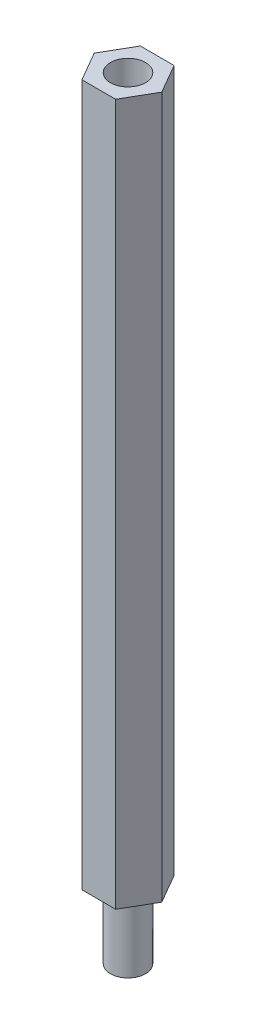
ISO-10303-21;
HEADER;
FILE_DESCRIPTION(('STEP AP214'),'2;1');
FILE_NAME('part.step','',(''),(''),'','','');
FILE_SCHEMA(('AUTOMOTIVE_DESIGN { 1 0 10303 214 1 1 1 1 }'));
ENDSEC;
DATA;
#1=APPLICATION_CONTEXT('core data for automotive mechanical design processes');
#2=APPLICATION_PROTOCOL_DEFINITION('international standard','automotive_design',2000,#1);
#3=PRODUCT_CONTEXT('',#1,'mechanical');
#4=PRODUCT('Part','Part','',(#3));
#5=PRODUCT_RELATED_PRODUCT_CATEGORY('part','',(#4));
#6=PRODUCT_DEFINITION_FORMATION('','',#4);
#7=PRODUCT_DEFINITION_CONTEXT('part definition',#1,'design');
#8=PRODUCT_DEFINITION('design','',#6,#7);
#9=PRODUCT_DEFINITION_SHAPE('','',#8);
#10=(LENGTH_UNIT() NAMED_UNIT(*) SI_UNIT(.MILLI.,.METRE.));
#11=(NAMED_UNIT(*) PLANE_ANGLE_UNIT() SI_UNIT($,.RADIAN.));
#12=(NAMED_UNIT(*) SI_UNIT($,.STERADIAN.) SOLID_ANGLE_UNIT());
#13=UNCERTAINTY_MEASURE_WITH_UNIT(LENGTH_MEASURE(1.E-05),#10,'distance_accuracy_value','');
#14=(GEOMETRIC_REPRESENTATION_CONTEXT(3) GLOBAL_UNCERTAINTY_ASSIGNED_CONTEXT((#13)) GLOBAL_UNIT_ASSIGNED_CONTEXT((#10,
#11,#12)) REPRESENTATION_CONTEXT('',''));
#15=CARTESIAN_POINT('',(0.,0.,0.));
#16=DIRECTION('',(0.,0.,1.));
#17=DIRECTION('',(1.,0.,0.));
#18=AXIS2_PLACEMENT_3D('',#15,#16,#17);
#19=CARTESIAN_POINT('',(0.,-6.,0.));
#20=DIRECTION('',(0.,1.,0.));
#21=DIRECTION('',(0.,0.,1.));
#22=AXIS2_PLACEMENT_3D('',#19,#20,#21);
#23=CYLINDRICAL_SURFACE('',#22,1.5);
#24=CARTESIAN_POINT('',(0.,-6.,0.));
#25=DIRECTION('',(0.,-1.,0.));
#26=DIRECTION('',(0.,0.,-1.));
#27=AXIS2_PLACEMENT_3D('',#24,#25,#26);
#28=CIRCLE('',#27,1.5);
#29=CARTESIAN_POINT('',(0.,-6.,-1.5));
#30=VERTEX_POINT('',#29);
#31=EDGE_CURVE('E11',#30,#30,#28,.T.);
#32=ORIENTED_EDGE('',*,*,#31,.F.);
#33=EDGE_LOOP('',(#32));
#34=FACE_BOUND('',#33,.T.);
#35=CARTESIAN_POINT('',(0.,0.,0.));
#36=DIRECTION('',(0.,-1.,0.));
#37=DIRECTION('',(0.,0.,-1.));
#38=AXIS2_PLACEMENT_3D('',#35,#36,#37);
#39=CIRCLE('',#38,1.5);
#40=CARTESIAN_POINT('',(0.,0.,-1.5));
#41=VERTEX_POINT('',#40);
#42=EDGE_CURVE('E44',#41,#41,#39,.T.);
#43=ORIENTED_EDGE('',*,*,#42,.T.);
#44=EDGE_LOOP('',(#43));
#45=FACE_BOUND('',#44,.T.);
#46=ADVANCED_FACE('F41',(#34,#45),#23,.T.);
#47=CARTESIAN_POINT('',(0.,-6.,0.));
#48=DIRECTION('',(0.,-1.,0.));
#49=DIRECTION('',(0.,0.,-1.));
#50=AXIS2_PLACEMENT_3D('',#47,#48,#49);
#51=PLANE('',#50);
#52=ORIENTED_EDGE('',*,*,#31,.T.);
#53=EDGE_LOOP('',(#52));
#54=FACE_BOUND('',#53,.T.);
#55=ADVANCED_FACE('F56',(#54),#51,.T.);
#56=CARTESIAN_POINT('',(0.,0.,0.));
#57=DIRECTION('',(0.,-1.,0.));
#58=DIRECTION('',(0.,0.,-1.));
#59=AXIS2_PLACEMENT_3D('',#56,#57,#58);
#60=PLANE('',#59);
#61=ORIENTED_EDGE('',*,*,#42,.F.);
#62=EDGE_LOOP('',(#61));
#63=FACE_BOUND('',#62,.T.);
#64=ADVANCED_FACE('F54',(#63),#60,.F.);
#65=CLOSED_SHELL('',(#46,#55,#64));
#66=MANIFOLD_SOLID_BREP('B2',#65);
#67=CARTESIAN_POINT('',(0.,60.,0.));
#68=DIRECTION('',(0.,1.,0.));
#69=DIRECTION('',(0.,0.,1.));
#70=AXIS2_PLACEMENT_3D('',#67,#68,#69);
#71=PLANE('',#70);
#72=DIRECTION('',(1.,0.,0.));
#73=VECTOR('',#72,1.);
#74=CARTESIAN_POINT('',(-1.44337567297405,60.,2.5));
#75=LINE('',#74,#73);
#76=CARTESIAN_POINT('',(-1.44337567297405,60.,2.5));
#77=VERTEX_POINT('',#76);
#78=CARTESIAN_POINT('',(1.44337567297408,60.,2.5));
#79=VERTEX_POINT('',#78);
#80=EDGE_CURVE('E178',#77,#79,#75,.T.);
#81=ORIENTED_EDGE('',*,*,#80,.T.);
#82=DIRECTION('',(0.500000000000001,0.,-0.866025403784438));
#83=VECTOR('',#82,1.);
#84=CARTESIAN_POINT('',(1.44337567297408,60.,2.5));
#85=LINE('',#84,#83);
#86=CARTESIAN_POINT('',(2.88675134594815,60.,0.));
#87=VERTEX_POINT('',#86);
#88=EDGE_CURVE('E136',#79,#87,#85,.T.);
#89=ORIENTED_EDGE('',*,*,#88,.T.);
#90=DIRECTION('',(-0.500000000000001,0.,-0.866025403784438));
#91=VECTOR('',#90,1.);
#92=CARTESIAN_POINT('',(2.88675134594815,60.,0.));
#93=LINE('',#92,#91);
#94=CARTESIAN_POINT('',(1.44337567297408,60.,-2.50000000000001));
#95=VERTEX_POINT('',#94);
#96=EDGE_CURVE('E149',#87,#95,#93,.T.);
#97=ORIENTED_EDGE('',*,*,#96,.T.);
#98=DIRECTION('',(-1.,0.,0.));
#99=VECTOR('',#98,1.);
#100=CARTESIAN_POINT('',(1.44337567297408,60.,-2.50000000000001));
#101=LINE('',#100,#99);
#102=CARTESIAN_POINT('',(-1.44337567297405,60.,-2.50000000000001));
#103=VERTEX_POINT('',#102);
#104=EDGE_CURVE('E143',#95,#103,#101,.T.);
#105=ORIENTED_EDGE('',*,*,#104,.T.);
#106=DIRECTION('',(-0.5,0.,0.866025403784438));
#107=VECTOR('',#106,1.);
#108=CARTESIAN_POINT('',(-1.44337567297405,60.,-2.50000000000001));
#109=LINE('',#108,#107);
#110=CARTESIAN_POINT('',(-2.88675134594812,60.,0.));
#111=VERTEX_POINT('',#110);
#112=EDGE_CURVE('E147',#103,#111,#109,.T.);
#113=ORIENTED_EDGE('',*,*,#112,.T.);
#114=DIRECTION('',(0.5,0.,0.866025403784438));
#115=VECTOR('',#114,1.);
#116=CARTESIAN_POINT('',(-2.88675134594812,60.,0.));
#117=LINE('',#116,#115);
#118=EDGE_CURVE('E99',#111,#77,#117,.T.);
#119=ORIENTED_EDGE('',*,*,#118,.T.);
#120=EDGE_LOOP('',(#81,#89,#97,#105,#113,#119));
#121=FACE_BOUND('',#120,.T.);
#122=CARTESIAN_POINT('',(0.,60.,0.));
#123=DIRECTION('',(0.,1.,0.));
#124=DIRECTION('',(0.,0.,1.));
#125=AXIS2_PLACEMENT_3D('',#122,#123,#124);
#126=CIRCLE('',#125,1.5);
#127=CARTESIAN_POINT('',(0.,60.,1.5));
#128=VERTEX_POINT('',#127);
#129=EDGE_CURVE('E171',#128,#128,#126,.T.);
#130=ORIENTED_EDGE('',*,*,#129,.F.);
#131=EDGE_LOOP('',(#130));
#132=FACE_BOUND('',#131,.T.);
#133=ADVANCED_FACE('F82',(#121,#132),#71,.T.);
#134=CARTESIAN_POINT('',(0.,0.,0.));
#135=DIRECTION('',(0.,1.,0.));
#136=DIRECTION('',(0.,0.,1.));
#137=AXIS2_PLACEMENT_3D('',#134,#135,#136);
#138=PLANE('',#137);
#139=DIRECTION('',(1.,0.,0.));
#140=VECTOR('',#139,1.);
#141=CARTESIAN_POINT('',(-1.44337567297405,0.,2.5));
#142=LINE('',#141,#140);
#143=CARTESIAN_POINT('',(-1.44337567297405,0.,2.5));
#144=VERTEX_POINT('',#143);
#145=CARTESIAN_POINT('',(1.44337567297408,0.,2.5));
#146=VERTEX_POINT('',#145);
#147=EDGE_CURVE('E167',#144,#146,#142,.T.);
#148=ORIENTED_EDGE('',*,*,#147,.F.);
#149=DIRECTION('',(0.5,0.,0.866025403784438));
#150=VECTOR('',#149,1.);
#151=CARTESIAN_POINT('',(-2.88675134594812,0.,0.));
#152=LINE('',#151,#150);
#153=CARTESIAN_POINT('',(-2.88675134594812,0.,0.));
#154=VERTEX_POINT('',#153);
#155=EDGE_CURVE('E128',#154,#144,#152,.T.);
#156=ORIENTED_EDGE('',*,*,#155,.F.);
#157=DIRECTION('',(-0.5,0.,0.866025403784438));
#158=VECTOR('',#157,1.);
#159=CARTESIAN_POINT('',(-1.44337567297405,0.,-2.50000000000001));
#160=LINE('',#159,#158);
#161=CARTESIAN_POINT('',(-1.44337567297405,0.,-2.50000000000001));
#162=VERTEX_POINT('',#161);
#163=EDGE_CURVE('E122',#162,#154,#160,.T.);
#164=ORIENTED_EDGE('',*,*,#163,.F.);
#165=DIRECTION('',(-1.,0.,0.));
#166=VECTOR('',#165,1.);
#167=CARTESIAN_POINT('',(1.44337567297408,0.,-2.50000000000001));
#168=LINE('',#167,#166);
#169=CARTESIAN_POINT('',(1.44337567297408,0.,-2.50000000000001));
#170=VERTEX_POINT('',#169);
#171=EDGE_CURVE('E157',#170,#162,#168,.T.);
#172=ORIENTED_EDGE('',*,*,#171,.F.);
#173=DIRECTION('',(-0.500000000000001,0.,-0.866025403784438));
#174=VECTOR('',#173,1.);
#175=CARTESIAN_POINT('',(2.88675134594815,0.,0.));
#176=LINE('',#175,#174);
#177=CARTESIAN_POINT('',(2.88675134594815,0.,0.));
#178=VERTEX_POINT('',#177);
#179=EDGE_CURVE('E173',#178,#170,#176,.T.);
#180=ORIENTED_EDGE('',*,*,#179,.F.);
#181=DIRECTION('',(0.500000000000001,0.,-0.866025403784438));
#182=VECTOR('',#181,1.);
#183=CARTESIAN_POINT('',(1.44337567297408,0.,2.5));
#184=LINE('',#183,#182);
#185=EDGE_CURVE('E170',#146,#178,#184,.T.);
#186=ORIENTED_EDGE('',*,*,#185,.F.);
#187=EDGE_LOOP('',(#148,#156,#164,#172,#180,#186));
#188=FACE_BOUND('',#187,.T.);
#189=CARTESIAN_POINT('',(0.,0.,0.));
#190=DIRECTION('',(0.,1.,0.));
#191=DIRECTION('',(0.,0.,1.));
#192=AXIS2_PLACEMENT_3D('',#189,#190,#191);
#193=CIRCLE('',#192,1.5);
#194=CARTESIAN_POINT('',(0.,0.,1.5));
#195=VERTEX_POINT('',#194);
#196=EDGE_CURVE('E271',#195,#195,#193,.T.);
#197=ORIENTED_EDGE('',*,*,#196,.T.);
#198=EDGE_LOOP('',(#197));
#199=FACE_BOUND('',#198,.T.);
#200=ADVANCED_FACE('F187',(#188,#199),#138,.F.);
#201=CARTESIAN_POINT('',(-1.44337567297405,60.,2.5));
#202=DIRECTION('',(0.,0.,-1.));
#203=DIRECTION('',(-1.,0.,0.));
#204=AXIS2_PLACEMENT_3D('',#201,#202,#203);
#205=PLANE('',#204);
#206=ORIENTED_EDGE('',*,*,#147,.T.);
#207=DIRECTION('',(0.,-1.,0.));
#208=VECTOR('',#207,1.);
#209=CARTESIAN_POINT('',(1.44337567297408,60.,2.5));
#210=LINE('',#209,#208);
#211=EDGE_CURVE('E39',#79,#146,#210,.T.);
#212=ORIENTED_EDGE('',*,*,#211,.F.);
#213=ORIENTED_EDGE('',*,*,#80,.F.);
#214=DIRECTION('',(0.,-1.,0.));
#215=VECTOR('',#214,1.);
#216=CARTESIAN_POINT('',(-1.44337567297405,60.,2.5));
#217=LINE('',#216,#215);
#218=EDGE_CURVE('E163',#77,#144,#217,.T.);
#219=ORIENTED_EDGE('',*,*,#218,.T.);
#220=EDGE_LOOP('',(#206,#212,#213,#219));
#221=FACE_BOUND('',#220,.T.);
#222=ADVANCED_FACE('F84',(#221),#205,.F.);
#223=CARTESIAN_POINT('',(1.44337567297408,60.,2.5));
#224=DIRECTION('',(-0.866025403784438,0.,-0.500000000000001));
#225=DIRECTION('',(-0.500000000000001,0.,0.866025403784438));
#226=AXIS2_PLACEMENT_3D('',#223,#224,#225);
#227=PLANE('',#226);
#228=ORIENTED_EDGE('',*,*,#185,.T.);
#229=DIRECTION('',(0.,-1.,0.));
#230=VECTOR('',#229,1.);
#231=CARTESIAN_POINT('',(2.88675134594815,60.,0.));
#232=LINE('',#231,#230);
#233=EDGE_CURVE('E91',#87,#178,#232,.T.);
#234=ORIENTED_EDGE('',*,*,#233,.F.);
#235=ORIENTED_EDGE('',*,*,#88,.F.);
#236=ORIENTED_EDGE('',*,*,#211,.T.);
#237=EDGE_LOOP('',(#228,#234,#235,#236));
#238=FACE_BOUND('',#237,.T.);
#239=ADVANCED_FACE('F212',(#238),#227,.F.);
#240=CARTESIAN_POINT('',(2.88675134594815,60.,0.));
#241=DIRECTION('',(-0.866025403784438,0.,0.500000000000001));
#242=DIRECTION('',(0.500000000000001,0.,0.866025403784438));
#243=AXIS2_PLACEMENT_3D('',#240,#241,#242);
#244=PLANE('',#243);
#245=ORIENTED_EDGE('',*,*,#179,.T.);
#246=DIRECTION('',(0.,-1.,0.));
#247=VECTOR('',#246,1.);
#248=CARTESIAN_POINT('',(1.44337567297408,60.,-2.50000000000001));
#249=LINE('',#248,#247);
#250=EDGE_CURVE('E158',#95,#170,#249,.T.);
#251=ORIENTED_EDGE('',*,*,#250,.F.);
#252=ORIENTED_EDGE('',*,*,#96,.F.);
#253=ORIENTED_EDGE('',*,*,#233,.T.);
#254=EDGE_LOOP('',(#245,#251,#252,#253));
#255=FACE_BOUND('',#254,.T.);
#256=ADVANCED_FACE('F184',(#255),#244,.F.);
#257=CARTESIAN_POINT('',(1.44337567297408,60.,-2.50000000000001));
#258=DIRECTION('',(0.,0.,1.));
#259=DIRECTION('',(1.,0.,0.));
#260=AXIS2_PLACEMENT_3D('',#257,#258,#259);
#261=PLANE('',#260);
#262=ORIENTED_EDGE('',*,*,#171,.T.);
#263=DIRECTION('',(0.,-1.,0.));
#264=VECTOR('',#263,1.);
#265=CARTESIAN_POINT('',(-1.44337567297405,60.,-2.50000000000001));
#266=LINE('',#265,#264);
#267=EDGE_CURVE('E154',#103,#162,#266,.T.);
#268=ORIENTED_EDGE('',*,*,#267,.F.);
#269=ORIENTED_EDGE('',*,*,#104,.F.);
#270=ORIENTED_EDGE('',*,*,#250,.T.);
#271=EDGE_LOOP('',(#262,#268,#269,#270));
#272=FACE_BOUND('',#271,.T.);
#273=ADVANCED_FACE('F155',(#272),#261,.F.);
#274=CARTESIAN_POINT('',(-1.44337567297405,60.,-2.50000000000001));
#275=DIRECTION('',(0.866025403784439,0.,0.5));
#276=DIRECTION('',(0.5,0.,-0.866025403784439));
#277=AXIS2_PLACEMENT_3D('',#274,#275,#276);
#278=PLANE('',#277);
#279=ORIENTED_EDGE('',*,*,#163,.T.);
#280=DIRECTION('',(0.,-1.,0.));
#281=VECTOR('',#280,1.);
#282=CARTESIAN_POINT('',(-2.88675134594812,60.,0.));
#283=LINE('',#282,#281);
#284=EDGE_CURVE('E159',#111,#154,#283,.T.);
#285=ORIENTED_EDGE('',*,*,#284,.F.);
#286=ORIENTED_EDGE('',*,*,#112,.F.);
#287=ORIENTED_EDGE('',*,*,#267,.T.);
#288=EDGE_LOOP('',(#279,#285,#286,#287));
#289=FACE_BOUND('',#288,.T.);
#290=ADVANCED_FACE('F161',(#289),#278,.F.);
#291=CARTESIAN_POINT('',(-2.88675134594812,60.,0.));
#292=DIRECTION('',(0.866025403784438,0.,-0.5));
#293=DIRECTION('',(-0.5,0.,-0.866025403784438));
#294=AXIS2_PLACEMENT_3D('',#291,#292,#293);
#295=PLANE('',#294);
#296=ORIENTED_EDGE('',*,*,#155,.T.);
#297=ORIENTED_EDGE('',*,*,#218,.F.);
#298=ORIENTED_EDGE('',*,*,#118,.F.);
#299=ORIENTED_EDGE('',*,*,#284,.T.);
#300=EDGE_LOOP('',(#296,#297,#298,#299));
#301=FACE_BOUND('',#300,.T.);
#302=ADVANCED_FACE('F192',(#301),#295,.F.);
#303=CARTESIAN_POINT('',(0.,60.,0.));
#304=DIRECTION('',(0.,-1.,0.));
#305=DIRECTION('',(0.,0.,-1.));
#306=AXIS2_PLACEMENT_3D('',#303,#304,#305);
#307=CYLINDRICAL_SURFACE('',#306,1.5);
#308=ORIENTED_EDGE('',*,*,#129,.T.);
#309=EDGE_LOOP('',(#308));
#310=FACE_BOUND('',#309,.T.);
#311=ORIENTED_EDGE('',*,*,#196,.F.);
#312=EDGE_LOOP('',(#311));
#313=FACE_BOUND('',#312,.T.);
#314=ADVANCED_FACE('F194',(#310,#313),#307,.F.);
#315=CLOSED_SHELL('',(#133,#200,#222,#239,#256,#273,#290,#302,#314));
#316=MANIFOLD_SOLID_BREP('B6',#315);
#317=ADVANCED_BREP_SHAPE_REPRESENTATION('',(#18,#66,#316),#14);
#318=SHAPE_DEFINITION_REPRESENTATION(#9,#317);
ENDSEC;
END-ISO-10303-21;
